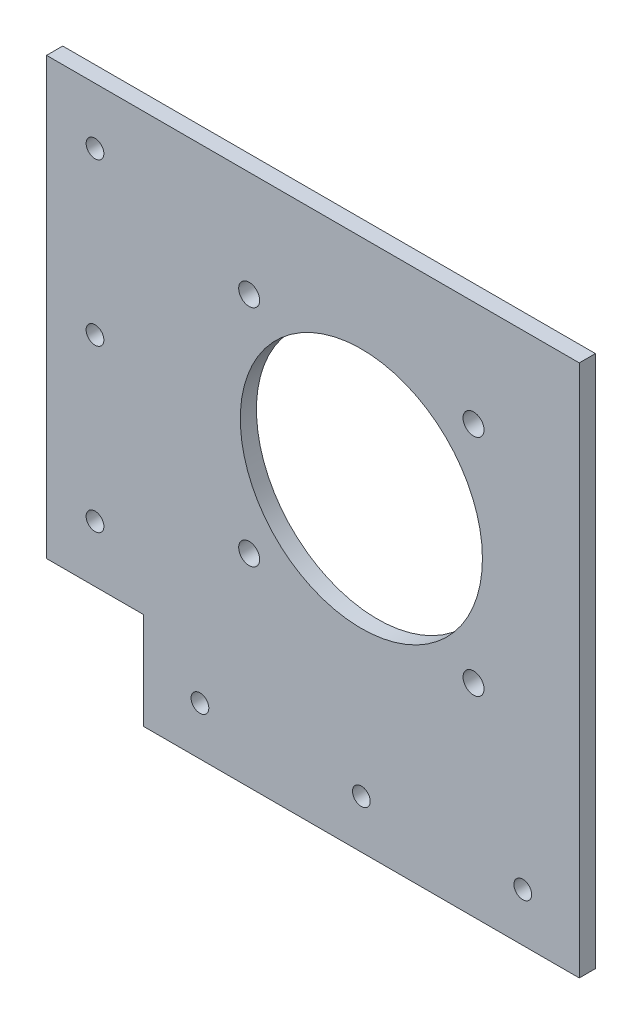
ISO-10303-21;
HEADER;
FILE_DESCRIPTION(('STEP AP214'),'2;1');
FILE_NAME('part.step','',(''),(''),'','','');
FILE_SCHEMA(('AUTOMOTIVE_DESIGN { 1 0 10303 214 1 1 1 1 }'));
ENDSEC;
DATA;
#1=APPLICATION_CONTEXT('core data for automotive mechanical design processes');
#2=APPLICATION_PROTOCOL_DEFINITION('international standard','automotive_design',2000,#1);
#3=PRODUCT_CONTEXT('',#1,'mechanical');
#4=PRODUCT('Part','Part','',(#3));
#5=PRODUCT_RELATED_PRODUCT_CATEGORY('part','',(#4));
#6=PRODUCT_DEFINITION_FORMATION('','',#4);
#7=PRODUCT_DEFINITION_CONTEXT('part definition',#1,'design');
#8=PRODUCT_DEFINITION('design','',#6,#7);
#9=PRODUCT_DEFINITION_SHAPE('','',#8);
#10=(LENGTH_UNIT() NAMED_UNIT(*) SI_UNIT(.MILLI.,.METRE.));
#11=(NAMED_UNIT(*) PLANE_ANGLE_UNIT() SI_UNIT($,.RADIAN.));
#12=(NAMED_UNIT(*) SI_UNIT($,.STERADIAN.) SOLID_ANGLE_UNIT());
#13=UNCERTAINTY_MEASURE_WITH_UNIT(LENGTH_MEASURE(1.E-05),#10,'distance_accuracy_value','');
#14=(GEOMETRIC_REPRESENTATION_CONTEXT(3) GLOBAL_UNCERTAINTY_ASSIGNED_CONTEXT((#13)) GLOBAL_UNIT_ASSIGNED_CONTEXT((#10,
#11,#12)) REPRESENTATION_CONTEXT('',''));
#15=CARTESIAN_POINT('',(0.,0.,0.));
#16=DIRECTION('',(0.,0.,1.));
#17=DIRECTION('',(1.,0.,0.));
#18=AXIS2_PLACEMENT_3D('',#15,#16,#17);
#19=CARTESIAN_POINT('',(0.,0.,5.));
#20=DIRECTION('',(0.,0.,1.));
#21=DIRECTION('',(1.,0.,0.));
#22=AXIS2_PLACEMENT_3D('',#19,#20,#21);
#23=PLANE('',#22);
#24=CARTESIAN_POINT('',(-117.5,15.,5.));
#25=DIRECTION('',(0.,0.,1.));
#26=DIRECTION('',(1.,0.,0.));
#27=AXIS2_PLACEMENT_3D('',#24,#25,#26);
#28=CIRCLE('',#27,2.75000000000001);
#29=CARTESIAN_POINT('',(-114.75,15.,5.));
#30=VERTEX_POINT('',#29);
#31=EDGE_CURVE('E240',#30,#30,#28,.T.);
#32=ORIENTED_EDGE('',*,*,#31,.F.);
#33=EDGE_LOOP('',(#32));
#34=FACE_BOUND('',#33,.T.);
#35=CARTESIAN_POINT('',(-67.5,15.,5.));
#36=DIRECTION('',(0.,0.,1.));
#37=DIRECTION('',(1.,0.,0.));
#38=AXIS2_PLACEMENT_3D('',#35,#36,#37);
#39=CIRCLE('',#38,2.75000000000001);
#40=CARTESIAN_POINT('',(-64.75,15.,5.));
#41=VERTEX_POINT('',#40);
#42=EDGE_CURVE('E256',#41,#41,#39,.T.);
#43=ORIENTED_EDGE('',*,*,#42,.F.);
#44=EDGE_LOOP('',(#43));
#45=FACE_BOUND('',#44,.T.);
#46=CARTESIAN_POINT('',(-150.,147.5,5.));
#47=DIRECTION('',(0.,0.,1.));
#48=DIRECTION('',(1.,0.,0.));
#49=AXIS2_PLACEMENT_3D('',#46,#47,#48);
#50=CIRCLE('',#49,2.75000000000001);
#51=CARTESIAN_POINT('',(-147.25,147.5,5.));
#52=VERTEX_POINT('',#51);
#53=EDGE_CURVE('E272',#52,#52,#50,.T.);
#54=ORIENTED_EDGE('',*,*,#53,.F.);
#55=EDGE_LOOP('',(#54));
#56=FACE_BOUND('',#55,.T.);
#57=CARTESIAN_POINT('',(-32.75,62.75,5.));
#58=DIRECTION('',(0.,0.,1.));
#59=DIRECTION('',(1.,0.,0.));
#60=AXIS2_PLACEMENT_3D('',#57,#58,#59);
#61=CIRCLE('',#60,3.25);
#62=CARTESIAN_POINT('',(-29.5,62.75,5.));
#63=VERTEX_POINT('',#62);
#64=EDGE_CURVE('E288',#63,#63,#61,.T.);
#65=ORIENTED_EDGE('',*,*,#64,.F.);
#66=EDGE_LOOP('',(#65));
#67=FACE_BOUND('',#66,.T.);
#68=CARTESIAN_POINT('',(-102.25,132.25,5.));
#69=DIRECTION('',(0.,0.,1.));
#70=DIRECTION('',(1.,0.,0.));
#71=AXIS2_PLACEMENT_3D('',#68,#69,#70);
#72=CIRCLE('',#71,3.25000000000001);
#73=CARTESIAN_POINT('',(-99.,132.25,5.));
#74=VERTEX_POINT('',#73);
#75=EDGE_CURVE('E304',#74,#74,#72,.T.);
#76=ORIENTED_EDGE('',*,*,#75,.F.);
#77=EDGE_LOOP('',(#76));
#78=FACE_BOUND('',#77,.T.);
#79=DIRECTION('',(0.,1.,0.));
#80=VECTOR('',#79,1.);
#81=CARTESIAN_POINT('',(0.,0.,5.));
#82=LINE('',#81,#80);
#83=CARTESIAN_POINT('',(0.,0.,5.));
#84=VERTEX_POINT('',#83);
#85=CARTESIAN_POINT('',(0.,165.,5.));
#86=VERTEX_POINT('',#85);
#87=EDGE_CURVE('E146',#84,#86,#82,.T.);
#88=ORIENTED_EDGE('',*,*,#87,.T.);
#89=DIRECTION('',(-1.,0.,0.));
#90=VECTOR('',#89,1.);
#91=CARTESIAN_POINT('',(0.,165.,5.));
#92=LINE('',#91,#90);
#93=CARTESIAN_POINT('',(-165.,165.,5.));
#94=VERTEX_POINT('',#93);
#95=EDGE_CURVE('E94',#86,#94,#92,.T.);
#96=ORIENTED_EDGE('',*,*,#95,.T.);
#97=DIRECTION('',(0.,-1.,0.));
#98=VECTOR('',#97,1.);
#99=CARTESIAN_POINT('',(-165.,30.,5.));
#100=LINE('',#99,#98);
#101=CARTESIAN_POINT('',(-165.,30.,5.));
#102=VERTEX_POINT('',#101);
#103=EDGE_CURVE('E107',#94,#102,#100,.T.);
#104=ORIENTED_EDGE('',*,*,#103,.T.);
#105=DIRECTION('',(1.,0.,0.));
#106=VECTOR('',#105,1.);
#107=CARTESIAN_POINT('',(-165.,30.,5.));
#108=LINE('',#107,#106);
#109=CARTESIAN_POINT('',(-135.,30.,5.));
#110=VERTEX_POINT('',#109);
#111=EDGE_CURVE('E101',#102,#110,#108,.T.);
#112=ORIENTED_EDGE('',*,*,#111,.T.);
#113=DIRECTION('',(0.,-1.,0.));
#114=VECTOR('',#113,1.);
#115=CARTESIAN_POINT('',(-135.,0.,5.));
#116=LINE('',#115,#114);
#117=CARTESIAN_POINT('',(-135.,0.,5.));
#118=VERTEX_POINT('',#117);
#119=EDGE_CURVE('E105',#110,#118,#116,.T.);
#120=ORIENTED_EDGE('',*,*,#119,.T.);
#121=DIRECTION('',(1.,0.,0.));
#122=VECTOR('',#121,1.);
#123=CARTESIAN_POINT('',(0.,0.,5.));
#124=LINE('',#123,#122);
#125=EDGE_CURVE('E57',#118,#84,#124,.T.);
#126=ORIENTED_EDGE('',*,*,#125,.T.);
#127=EDGE_LOOP('',(#88,#96,#104,#112,#120,#126));
#128=FACE_BOUND('',#127,.T.);
#129=CARTESIAN_POINT('',(-67.5,97.5,5.));
#130=DIRECTION('',(0.,0.,1.));
#131=DIRECTION('',(1.,0.,0.));
#132=AXIS2_PLACEMENT_3D('',#129,#130,#131);
#133=CIRCLE('',#132,37.5);
#134=CARTESIAN_POINT('',(-30.,97.5,5.));
#135=VERTEX_POINT('',#134);
#136=EDGE_CURVE('E134',#135,#135,#133,.T.);
#137=ORIENTED_EDGE('',*,*,#136,.F.);
#138=EDGE_LOOP('',(#137));
#139=FACE_BOUND('',#138,.T.);
#140=CARTESIAN_POINT('',(-32.75,132.25,5.));
#141=DIRECTION('',(0.,0.,1.));
#142=DIRECTION('',(1.,0.,0.));
#143=AXIS2_PLACEMENT_3D('',#140,#141,#142);
#144=CIRCLE('',#143,3.25);
#145=CARTESIAN_POINT('',(-29.5,132.25,5.));
#146=VERTEX_POINT('',#145);
#147=EDGE_CURVE('E296',#146,#146,#144,.T.);
#148=ORIENTED_EDGE('',*,*,#147,.F.);
#149=EDGE_LOOP('',(#148));
#150=FACE_BOUND('',#149,.T.);
#151=CARTESIAN_POINT('',(-102.25,62.75,5.));
#152=DIRECTION('',(0.,0.,1.));
#153=DIRECTION('',(1.,0.,0.));
#154=AXIS2_PLACEMENT_3D('',#151,#152,#153);
#155=CIRCLE('',#154,3.25000000000001);
#156=CARTESIAN_POINT('',(-99.,62.75,5.));
#157=VERTEX_POINT('',#156);
#158=EDGE_CURVE('E280',#157,#157,#155,.T.);
#159=ORIENTED_EDGE('',*,*,#158,.F.);
#160=EDGE_LOOP('',(#159));
#161=FACE_BOUND('',#160,.T.);
#162=CARTESIAN_POINT('',(-150.,97.5,5.));
#163=DIRECTION('',(0.,0.,1.));
#164=DIRECTION('',(1.,0.,0.));
#165=AXIS2_PLACEMENT_3D('',#162,#163,#164);
#166=CIRCLE('',#165,2.75000000000001);
#167=CARTESIAN_POINT('',(-147.25,97.5,5.));
#168=VERTEX_POINT('',#167);
#169=EDGE_CURVE('E264',#168,#168,#166,.T.);
#170=ORIENTED_EDGE('',*,*,#169,.F.);
#171=EDGE_LOOP('',(#170));
#172=FACE_BOUND('',#171,.T.);
#173=CARTESIAN_POINT('',(-17.5,15.,5.));
#174=DIRECTION('',(0.,0.,1.));
#175=DIRECTION('',(1.,0.,0.));
#176=AXIS2_PLACEMENT_3D('',#173,#174,#175);
#177=CIRCLE('',#176,2.75);
#178=CARTESIAN_POINT('',(-14.75,15.,5.));
#179=VERTEX_POINT('',#178);
#180=EDGE_CURVE('E248',#179,#179,#177,.T.);
#181=ORIENTED_EDGE('',*,*,#180,.F.);
#182=EDGE_LOOP('',(#181));
#183=FACE_BOUND('',#182,.T.);
#184=CARTESIAN_POINT('',(-150.,47.5,5.));
#185=DIRECTION('',(0.,0.,1.));
#186=DIRECTION('',(1.,0.,0.));
#187=AXIS2_PLACEMENT_3D('',#184,#185,#186);
#188=CIRCLE('',#187,2.75000000000001);
#189=CARTESIAN_POINT('',(-147.25,47.5,5.));
#190=VERTEX_POINT('',#189);
#191=EDGE_CURVE('E229',#190,#190,#188,.T.);
#192=ORIENTED_EDGE('',*,*,#191,.F.);
#193=EDGE_LOOP('',(#192));
#194=FACE_BOUND('',#193,.T.);
#195=ADVANCED_FACE('F39',(#34,#45,#56,#67,#78,#128,#139,#150,#161,#172,#183,#194),#23,.T.);
#196=CARTESIAN_POINT('',(0.,0.,0.));
#197=DIRECTION('',(0.,0.,1.));
#198=DIRECTION('',(1.,0.,0.));
#199=AXIS2_PLACEMENT_3D('',#196,#197,#198);
#200=PLANE('',#199);
#201=DIRECTION('',(0.,1.,0.));
#202=VECTOR('',#201,1.);
#203=CARTESIAN_POINT('',(0.,0.,0.));
#204=LINE('',#203,#202);
#205=CARTESIAN_POINT('',(0.,0.,0.));
#206=VERTEX_POINT('',#205);
#207=CARTESIAN_POINT('',(0.,165.,0.));
#208=VERTEX_POINT('',#207);
#209=EDGE_CURVE('E129',#206,#208,#204,.T.);
#210=ORIENTED_EDGE('',*,*,#209,.F.);
#211=DIRECTION('',(1.,0.,0.));
#212=VECTOR('',#211,1.);
#213=CARTESIAN_POINT('',(0.,0.,0.));
#214=LINE('',#213,#212);
#215=CARTESIAN_POINT('',(-135.,0.,0.));
#216=VERTEX_POINT('',#215);
#217=EDGE_CURVE('E86',#216,#206,#214,.T.);
#218=ORIENTED_EDGE('',*,*,#217,.F.);
#219=DIRECTION('',(0.,-1.,0.));
#220=VECTOR('',#219,1.);
#221=CARTESIAN_POINT('',(-135.,0.,0.));
#222=LINE('',#221,#220);
#223=CARTESIAN_POINT('',(-135.,30.,0.));
#224=VERTEX_POINT('',#223);
#225=EDGE_CURVE('E80',#224,#216,#222,.T.);
#226=ORIENTED_EDGE('',*,*,#225,.F.);
#227=DIRECTION('',(1.,0.,0.));
#228=VECTOR('',#227,1.);
#229=CARTESIAN_POINT('',(-165.,30.,0.));
#230=LINE('',#229,#228);
#231=CARTESIAN_POINT('',(-165.,30.,0.));
#232=VERTEX_POINT('',#231);
#233=EDGE_CURVE('E116',#232,#224,#230,.T.);
#234=ORIENTED_EDGE('',*,*,#233,.F.);
#235=DIRECTION('',(0.,-1.,0.));
#236=VECTOR('',#235,1.);
#237=CARTESIAN_POINT('',(-165.,30.,0.));
#238=LINE('',#237,#236);
#239=CARTESIAN_POINT('',(-165.,165.,0.));
#240=VERTEX_POINT('',#239);
#241=EDGE_CURVE('E137',#240,#232,#238,.T.);
#242=ORIENTED_EDGE('',*,*,#241,.F.);
#243=DIRECTION('',(-1.,0.,0.));
#244=VECTOR('',#243,1.);
#245=CARTESIAN_POINT('',(0.,165.,0.));
#246=LINE('',#245,#244);
#247=EDGE_CURVE('E133',#208,#240,#246,.T.);
#248=ORIENTED_EDGE('',*,*,#247,.F.);
#249=EDGE_LOOP('',(#210,#218,#226,#234,#242,#248));
#250=FACE_BOUND('',#249,.T.);
#251=CARTESIAN_POINT('',(-67.5,97.5,0.));
#252=DIRECTION('',(0.,0.,1.));
#253=DIRECTION('',(1.,0.,0.));
#254=AXIS2_PLACEMENT_3D('',#251,#252,#253);
#255=CIRCLE('',#254,37.5);
#256=CARTESIAN_POINT('',(-30.,97.5,0.));
#257=VERTEX_POINT('',#256);
#258=EDGE_CURVE('E308',#257,#257,#255,.T.);
#259=ORIENTED_EDGE('',*,*,#258,.T.);
#260=EDGE_LOOP('',(#259));
#261=FACE_BOUND('',#260,.T.);
#262=CARTESIAN_POINT('',(-102.25,132.25,0.));
#263=DIRECTION('',(0.,0.,1.));
#264=DIRECTION('',(1.,0.,0.));
#265=AXIS2_PLACEMENT_3D('',#262,#263,#264);
#266=CIRCLE('',#265,3.25000000000001);
#267=CARTESIAN_POINT('',(-99.,132.25,0.));
#268=VERTEX_POINT('',#267);
#269=EDGE_CURVE('E300',#268,#268,#266,.T.);
#270=ORIENTED_EDGE('',*,*,#269,.T.);
#271=EDGE_LOOP('',(#270));
#272=FACE_BOUND('',#271,.T.);
#273=CARTESIAN_POINT('',(-32.75,132.25,0.));
#274=DIRECTION('',(0.,0.,1.));
#275=DIRECTION('',(1.,0.,0.));
#276=AXIS2_PLACEMENT_3D('',#273,#274,#275);
#277=CIRCLE('',#276,3.25);
#278=CARTESIAN_POINT('',(-29.5,132.25,0.));
#279=VERTEX_POINT('',#278);
#280=EDGE_CURVE('E292',#279,#279,#277,.T.);
#281=ORIENTED_EDGE('',*,*,#280,.T.);
#282=EDGE_LOOP('',(#281));
#283=FACE_BOUND('',#282,.T.);
#284=CARTESIAN_POINT('',(-32.75,62.75,0.));
#285=DIRECTION('',(0.,0.,1.));
#286=DIRECTION('',(1.,0.,0.));
#287=AXIS2_PLACEMENT_3D('',#284,#285,#286);
#288=CIRCLE('',#287,3.25);
#289=CARTESIAN_POINT('',(-29.5,62.75,0.));
#290=VERTEX_POINT('',#289);
#291=EDGE_CURVE('E284',#290,#290,#288,.T.);
#292=ORIENTED_EDGE('',*,*,#291,.T.);
#293=EDGE_LOOP('',(#292));
#294=FACE_BOUND('',#293,.T.);
#295=CARTESIAN_POINT('',(-102.25,62.75,0.));
#296=DIRECTION('',(0.,0.,1.));
#297=DIRECTION('',(1.,0.,0.));
#298=AXIS2_PLACEMENT_3D('',#295,#296,#297);
#299=CIRCLE('',#298,3.25000000000001);
#300=CARTESIAN_POINT('',(-99.,62.75,0.));
#301=VERTEX_POINT('',#300);
#302=EDGE_CURVE('E276',#301,#301,#299,.T.);
#303=ORIENTED_EDGE('',*,*,#302,.T.);
#304=EDGE_LOOP('',(#303));
#305=FACE_BOUND('',#304,.T.);
#306=CARTESIAN_POINT('',(-150.,147.5,0.));
#307=DIRECTION('',(0.,0.,1.));
#308=DIRECTION('',(1.,0.,0.));
#309=AXIS2_PLACEMENT_3D('',#306,#307,#308);
#310=CIRCLE('',#309,2.75000000000001);
#311=CARTESIAN_POINT('',(-147.25,147.5,0.));
#312=VERTEX_POINT('',#311);
#313=EDGE_CURVE('E268',#312,#312,#310,.T.);
#314=ORIENTED_EDGE('',*,*,#313,.T.);
#315=EDGE_LOOP('',(#314));
#316=FACE_BOUND('',#315,.T.);
#317=CARTESIAN_POINT('',(-150.,97.5,0.));
#318=DIRECTION('',(0.,0.,1.));
#319=DIRECTION('',(1.,0.,0.));
#320=AXIS2_PLACEMENT_3D('',#317,#318,#319);
#321=CIRCLE('',#320,2.75000000000001);
#322=CARTESIAN_POINT('',(-147.25,97.5,0.));
#323=VERTEX_POINT('',#322);
#324=EDGE_CURVE('E260',#323,#323,#321,.T.);
#325=ORIENTED_EDGE('',*,*,#324,.T.);
#326=EDGE_LOOP('',(#325));
#327=FACE_BOUND('',#326,.T.);
#328=CARTESIAN_POINT('',(-67.5,15.,0.));
#329=DIRECTION('',(0.,0.,1.));
#330=DIRECTION('',(1.,0.,0.));
#331=AXIS2_PLACEMENT_3D('',#328,#329,#330);
#332=CIRCLE('',#331,2.75000000000001);
#333=CARTESIAN_POINT('',(-64.75,15.,0.));
#334=VERTEX_POINT('',#333);
#335=EDGE_CURVE('E252',#334,#334,#332,.T.);
#336=ORIENTED_EDGE('',*,*,#335,.T.);
#337=EDGE_LOOP('',(#336));
#338=FACE_BOUND('',#337,.T.);
#339=CARTESIAN_POINT('',(-17.5,15.,0.));
#340=DIRECTION('',(0.,0.,1.));
#341=DIRECTION('',(1.,0.,0.));
#342=AXIS2_PLACEMENT_3D('',#339,#340,#341);
#343=CIRCLE('',#342,2.75);
#344=CARTESIAN_POINT('',(-14.75,15.,0.));
#345=VERTEX_POINT('',#344);
#346=EDGE_CURVE('E244',#345,#345,#343,.T.);
#347=ORIENTED_EDGE('',*,*,#346,.T.);
#348=EDGE_LOOP('',(#347));
#349=FACE_BOUND('',#348,.T.);
#350=CARTESIAN_POINT('',(-117.5,15.,0.));
#351=DIRECTION('',(0.,0.,1.));
#352=DIRECTION('',(1.,0.,0.));
#353=AXIS2_PLACEMENT_3D('',#350,#351,#352);
#354=CIRCLE('',#353,2.75000000000001);
#355=CARTESIAN_POINT('',(-114.75,15.,0.));
#356=VERTEX_POINT('',#355);
#357=EDGE_CURVE('E237',#356,#356,#354,.T.);
#358=ORIENTED_EDGE('',*,*,#357,.T.);
#359=EDGE_LOOP('',(#358));
#360=FACE_BOUND('',#359,.T.);
#361=CARTESIAN_POINT('',(-150.,47.5,0.));
#362=DIRECTION('',(0.,0.,1.));
#363=DIRECTION('',(1.,0.,0.));
#364=AXIS2_PLACEMENT_3D('',#361,#362,#363);
#365=CIRCLE('',#364,2.75000000000001);
#366=CARTESIAN_POINT('',(-147.25,47.5,0.));
#367=VERTEX_POINT('',#366);
#368=EDGE_CURVE('E232',#367,#367,#365,.T.);
#369=ORIENTED_EDGE('',*,*,#368,.T.);
#370=EDGE_LOOP('',(#369));
#371=FACE_BOUND('',#370,.T.);
#372=ADVANCED_FACE('F159',(#250,#261,#272,#283,#294,#305,#316,#327,#338,#349,#360,#371),#200,.F.);
#373=CARTESIAN_POINT('',(0.,0.,5.));
#374=DIRECTION('',(-1.,0.,0.));
#375=DIRECTION('',(0.,0.,1.));
#376=AXIS2_PLACEMENT_3D('',#373,#374,#375);
#377=PLANE('',#376);
#378=ORIENTED_EDGE('',*,*,#209,.T.);
#379=DIRECTION('',(0.,0.,-1.));
#380=VECTOR('',#379,1.);
#381=CARTESIAN_POINT('',(0.,165.,5.));
#382=LINE('',#381,#380);
#383=EDGE_CURVE('E11',#86,#208,#382,.T.);
#384=ORIENTED_EDGE('',*,*,#383,.F.);
#385=ORIENTED_EDGE('',*,*,#87,.F.);
#386=DIRECTION('',(0.,0.,-1.));
#387=VECTOR('',#386,1.);
#388=CARTESIAN_POINT('',(0.,0.,5.));
#389=LINE('',#388,#387);
#390=EDGE_CURVE('E125',#84,#206,#389,.T.);
#391=ORIENTED_EDGE('',*,*,#390,.T.);
#392=EDGE_LOOP('',(#378,#384,#385,#391));
#393=FACE_BOUND('',#392,.T.);
#394=ADVANCED_FACE('F41',(#393),#377,.F.);
#395=CARTESIAN_POINT('',(0.,165.,5.));
#396=DIRECTION('',(0.,-1.,0.));
#397=DIRECTION('',(0.,0.,-1.));
#398=AXIS2_PLACEMENT_3D('',#395,#396,#397);
#399=PLANE('',#398);
#400=ORIENTED_EDGE('',*,*,#247,.T.);
#401=DIRECTION('',(0.,0.,-1.));
#402=VECTOR('',#401,1.);
#403=CARTESIAN_POINT('',(-165.,165.,5.));
#404=LINE('',#403,#402);
#405=EDGE_CURVE('E49',#94,#240,#404,.T.);
#406=ORIENTED_EDGE('',*,*,#405,.F.);
#407=ORIENTED_EDGE('',*,*,#95,.F.);
#408=ORIENTED_EDGE('',*,*,#383,.T.);
#409=EDGE_LOOP('',(#400,#406,#407,#408));
#410=FACE_BOUND('',#409,.T.);
#411=ADVANCED_FACE('F435',(#410),#399,.F.);
#412=CARTESIAN_POINT('',(-165.,30.,5.));
#413=DIRECTION('',(1.,0.,0.));
#414=DIRECTION('',(0.,0.,-1.));
#415=AXIS2_PLACEMENT_3D('',#412,#413,#414);
#416=PLANE('',#415);
#417=ORIENTED_EDGE('',*,*,#241,.T.);
#418=DIRECTION('',(0.,0.,-1.));
#419=VECTOR('',#418,1.);
#420=CARTESIAN_POINT('',(-165.,30.,5.));
#421=LINE('',#420,#419);
#422=EDGE_CURVE('E118',#102,#232,#421,.T.);
#423=ORIENTED_EDGE('',*,*,#422,.F.);
#424=ORIENTED_EDGE('',*,*,#103,.F.);
#425=ORIENTED_EDGE('',*,*,#405,.T.);
#426=EDGE_LOOP('',(#417,#423,#424,#425));
#427=FACE_BOUND('',#426,.T.);
#428=ADVANCED_FACE('F156',(#427),#416,.F.);
#429=CARTESIAN_POINT('',(-165.,30.,5.));
#430=DIRECTION('',(0.,1.,0.));
#431=DIRECTION('',(0.,0.,1.));
#432=AXIS2_PLACEMENT_3D('',#429,#430,#431);
#433=PLANE('',#432);
#434=ORIENTED_EDGE('',*,*,#233,.T.);
#435=DIRECTION('',(0.,0.,-1.));
#436=VECTOR('',#435,1.);
#437=CARTESIAN_POINT('',(-135.,30.,5.));
#438=LINE('',#437,#436);
#439=EDGE_CURVE('E113',#110,#224,#438,.T.);
#440=ORIENTED_EDGE('',*,*,#439,.F.);
#441=ORIENTED_EDGE('',*,*,#111,.F.);
#442=ORIENTED_EDGE('',*,*,#422,.T.);
#443=EDGE_LOOP('',(#434,#440,#441,#442));
#444=FACE_BOUND('',#443,.T.);
#445=ADVANCED_FACE('F114',(#444),#433,.F.);
#446=CARTESIAN_POINT('',(-135.,0.,5.));
#447=DIRECTION('',(1.,0.,0.));
#448=DIRECTION('',(0.,0.,-1.));
#449=AXIS2_PLACEMENT_3D('',#446,#447,#448);
#450=PLANE('',#449);
#451=ORIENTED_EDGE('',*,*,#225,.T.);
#452=DIRECTION('',(0.,0.,-1.));
#453=VECTOR('',#452,1.);
#454=CARTESIAN_POINT('',(-135.,0.,5.));
#455=LINE('',#454,#453);
#456=EDGE_CURVE('E119',#118,#216,#455,.T.);
#457=ORIENTED_EDGE('',*,*,#456,.F.);
#458=ORIENTED_EDGE('',*,*,#119,.F.);
#459=ORIENTED_EDGE('',*,*,#439,.T.);
#460=EDGE_LOOP('',(#451,#457,#458,#459));
#461=FACE_BOUND('',#460,.T.);
#462=ADVANCED_FACE('F121',(#461),#450,.F.);
#463=CARTESIAN_POINT('',(0.,0.,5.));
#464=DIRECTION('',(0.,1.,0.));
#465=DIRECTION('',(0.,0.,1.));
#466=AXIS2_PLACEMENT_3D('',#463,#464,#465);
#467=PLANE('',#466);
#468=ORIENTED_EDGE('',*,*,#217,.T.);
#469=ORIENTED_EDGE('',*,*,#390,.F.);
#470=ORIENTED_EDGE('',*,*,#125,.F.);
#471=ORIENTED_EDGE('',*,*,#456,.T.);
#472=EDGE_LOOP('',(#468,#469,#470,#471));
#473=FACE_BOUND('',#472,.T.);
#474=ADVANCED_FACE('F164',(#473),#467,.F.);
#475=CARTESIAN_POINT('',(-67.5,97.5,5.));
#476=DIRECTION('',(0.,0.,-1.));
#477=DIRECTION('',(-1.,0.,0.));
#478=AXIS2_PLACEMENT_3D('',#475,#476,#477);
#479=CYLINDRICAL_SURFACE('',#478,37.5);
#480=ORIENTED_EDGE('',*,*,#136,.T.);
#481=EDGE_LOOP('',(#480));
#482=FACE_BOUND('',#481,.T.);
#483=ORIENTED_EDGE('',*,*,#258,.F.);
#484=EDGE_LOOP('',(#483));
#485=FACE_BOUND('',#484,.T.);
#486=ADVANCED_FACE('F166',(#482,#485),#479,.F.);
#487=CARTESIAN_POINT('',(-102.25,132.25,5.));
#488=DIRECTION('',(0.,0.,-1.));
#489=DIRECTION('',(-1.,0.,0.));
#490=AXIS2_PLACEMENT_3D('',#487,#488,#489);
#491=CYLINDRICAL_SURFACE('',#490,3.25000000000001);
#492=ORIENTED_EDGE('',*,*,#75,.T.);
#493=EDGE_LOOP('',(#492));
#494=FACE_BOUND('',#493,.T.);
#495=ORIENTED_EDGE('',*,*,#269,.F.);
#496=EDGE_LOOP('',(#495));
#497=FACE_BOUND('',#496,.T.);
#498=ADVANCED_FACE('F172',(#494,#497),#491,.F.);
#499=CARTESIAN_POINT('',(-32.75,132.25,5.));
#500=DIRECTION('',(0.,0.,-1.));
#501=DIRECTION('',(-1.,0.,0.));
#502=AXIS2_PLACEMENT_3D('',#499,#500,#501);
#503=CYLINDRICAL_SURFACE('',#502,3.25);
#504=ORIENTED_EDGE('',*,*,#147,.T.);
#505=EDGE_LOOP('',(#504));
#506=FACE_BOUND('',#505,.T.);
#507=ORIENTED_EDGE('',*,*,#280,.F.);
#508=EDGE_LOOP('',(#507));
#509=FACE_BOUND('',#508,.T.);
#510=ADVANCED_FACE('F188',(#506,#509),#503,.F.);
#511=CARTESIAN_POINT('',(-32.75,62.75,5.));
#512=DIRECTION('',(0.,0.,-1.));
#513=DIRECTION('',(-1.,0.,0.));
#514=AXIS2_PLACEMENT_3D('',#511,#512,#513);
#515=CYLINDRICAL_SURFACE('',#514,3.25);
#516=ORIENTED_EDGE('',*,*,#64,.T.);
#517=EDGE_LOOP('',(#516));
#518=FACE_BOUND('',#517,.T.);
#519=ORIENTED_EDGE('',*,*,#291,.F.);
#520=EDGE_LOOP('',(#519));
#521=FACE_BOUND('',#520,.T.);
#522=ADVANCED_FACE('F192',(#518,#521),#515,.F.);
#523=CARTESIAN_POINT('',(-102.25,62.75,5.));
#524=DIRECTION('',(0.,0.,-1.));
#525=DIRECTION('',(-1.,0.,0.));
#526=AXIS2_PLACEMENT_3D('',#523,#524,#525);
#527=CYLINDRICAL_SURFACE('',#526,3.25000000000001);
#528=ORIENTED_EDGE('',*,*,#158,.T.);
#529=EDGE_LOOP('',(#528));
#530=FACE_BOUND('',#529,.T.);
#531=ORIENTED_EDGE('',*,*,#302,.F.);
#532=EDGE_LOOP('',(#531));
#533=FACE_BOUND('',#532,.T.);
#534=ADVANCED_FACE('F196',(#530,#533),#527,.F.);
#535=CARTESIAN_POINT('',(-150.,147.5,5.));
#536=DIRECTION('',(0.,0.,-1.));
#537=DIRECTION('',(-1.,0.,0.));
#538=AXIS2_PLACEMENT_3D('',#535,#536,#537);
#539=CYLINDRICAL_SURFACE('',#538,2.75000000000001);
#540=ORIENTED_EDGE('',*,*,#53,.T.);
#541=EDGE_LOOP('',(#540));
#542=FACE_BOUND('',#541,.T.);
#543=ORIENTED_EDGE('',*,*,#313,.F.);
#544=EDGE_LOOP('',(#543));
#545=FACE_BOUND('',#544,.T.);
#546=ADVANCED_FACE('F200',(#542,#545),#539,.F.);
#547=CARTESIAN_POINT('',(-150.,97.5,5.));
#548=DIRECTION('',(0.,0.,-1.));
#549=DIRECTION('',(-1.,0.,0.));
#550=AXIS2_PLACEMENT_3D('',#547,#548,#549);
#551=CYLINDRICAL_SURFACE('',#550,2.75000000000001);
#552=ORIENTED_EDGE('',*,*,#169,.T.);
#553=EDGE_LOOP('',(#552));
#554=FACE_BOUND('',#553,.T.);
#555=ORIENTED_EDGE('',*,*,#324,.F.);
#556=EDGE_LOOP('',(#555));
#557=FACE_BOUND('',#556,.T.);
#558=ADVANCED_FACE('F204',(#554,#557),#551,.F.);
#559=CARTESIAN_POINT('',(-67.5,15.,5.));
#560=DIRECTION('',(0.,0.,-1.));
#561=DIRECTION('',(-1.,0.,0.));
#562=AXIS2_PLACEMENT_3D('',#559,#560,#561);
#563=CYLINDRICAL_SURFACE('',#562,2.75000000000001);
#564=ORIENTED_EDGE('',*,*,#42,.T.);
#565=EDGE_LOOP('',(#564));
#566=FACE_BOUND('',#565,.T.);
#567=ORIENTED_EDGE('',*,*,#335,.F.);
#568=EDGE_LOOP('',(#567));
#569=FACE_BOUND('',#568,.T.);
#570=ADVANCED_FACE('F208',(#566,#569),#563,.F.);
#571=CARTESIAN_POINT('',(-17.5,15.,5.));
#572=DIRECTION('',(0.,0.,-1.));
#573=DIRECTION('',(-1.,0.,0.));
#574=AXIS2_PLACEMENT_3D('',#571,#572,#573);
#575=CYLINDRICAL_SURFACE('',#574,2.75);
#576=ORIENTED_EDGE('',*,*,#180,.T.);
#577=EDGE_LOOP('',(#576));
#578=FACE_BOUND('',#577,.T.);
#579=ORIENTED_EDGE('',*,*,#346,.F.);
#580=EDGE_LOOP('',(#579));
#581=FACE_BOUND('',#580,.T.);
#582=ADVANCED_FACE('F212',(#578,#581),#575,.F.);
#583=CARTESIAN_POINT('',(-117.5,15.,5.));
#584=DIRECTION('',(0.,0.,-1.));
#585=DIRECTION('',(-1.,0.,0.));
#586=AXIS2_PLACEMENT_3D('',#583,#584,#585);
#587=CYLINDRICAL_SURFACE('',#586,2.75000000000001);
#588=ORIENTED_EDGE('',*,*,#31,.T.);
#589=EDGE_LOOP('',(#588));
#590=FACE_BOUND('',#589,.T.);
#591=ORIENTED_EDGE('',*,*,#357,.F.);
#592=EDGE_LOOP('',(#591));
#593=FACE_BOUND('',#592,.T.);
#594=ADVANCED_FACE('F216',(#590,#593),#587,.F.);
#595=CARTESIAN_POINT('',(-150.,47.5,5.));
#596=DIRECTION('',(0.,0.,-1.));
#597=DIRECTION('',(-1.,0.,0.));
#598=AXIS2_PLACEMENT_3D('',#595,#596,#597);
#599=CYLINDRICAL_SURFACE('',#598,2.75000000000001);
#600=ORIENTED_EDGE('',*,*,#191,.T.);
#601=EDGE_LOOP('',(#600));
#602=FACE_BOUND('',#601,.T.);
#603=ORIENTED_EDGE('',*,*,#368,.F.);
#604=EDGE_LOOP('',(#603));
#605=FACE_BOUND('',#604,.T.);
#606=ADVANCED_FACE('F220',(#602,#605),#599,.F.);
#607=CLOSED_SHELL('',(#195,#372,#394,#411,#428,#445,#462,#474,#486,#498,#510,#522,#534,#546,
#558,#570,#582,#594,#606));
#608=MANIFOLD_SOLID_BREP('B2',#607);
#609=ADVANCED_BREP_SHAPE_REPRESENTATION('',(#18,#608),#14);
#610=SHAPE_DEFINITION_REPRESENTATION(#9,#609);
ENDSEC;
END-ISO-10303-21;
